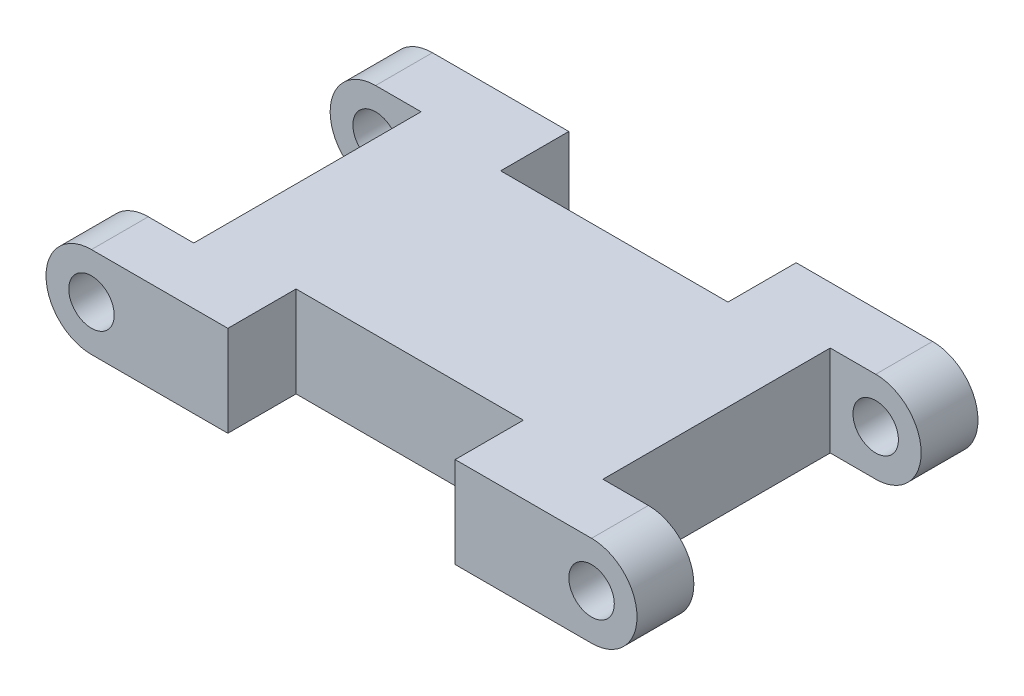
ISO-10303-21;
HEADER;
FILE_DESCRIPTION(('STEP AP214'),'2;1');
FILE_NAME('part.step','',(''),(''),'','','');
FILE_SCHEMA(('AUTOMOTIVE_DESIGN { 1 0 10303 214 1 1 1 1 }'));
ENDSEC;
DATA;
#1=APPLICATION_CONTEXT('core data for automotive mechanical design processes');
#2=APPLICATION_PROTOCOL_DEFINITION('international standard','automotive_design',2000,#1);
#3=PRODUCT_CONTEXT('',#1,'mechanical');
#4=PRODUCT('Part','Part','',(#3));
#5=PRODUCT_RELATED_PRODUCT_CATEGORY('part','',(#4));
#6=PRODUCT_DEFINITION_FORMATION('','',#4);
#7=PRODUCT_DEFINITION_CONTEXT('part definition',#1,'design');
#8=PRODUCT_DEFINITION('design','',#6,#7);
#9=PRODUCT_DEFINITION_SHAPE('','',#8);
#10=(LENGTH_UNIT() NAMED_UNIT(*) SI_UNIT(.MILLI.,.METRE.));
#11=(NAMED_UNIT(*) PLANE_ANGLE_UNIT() SI_UNIT($,.RADIAN.));
#12=(NAMED_UNIT(*) SI_UNIT($,.STERADIAN.) SOLID_ANGLE_UNIT());
#13=UNCERTAINTY_MEASURE_WITH_UNIT(LENGTH_MEASURE(1.E-05),#10,'distance_accuracy_value','');
#14=(GEOMETRIC_REPRESENTATION_CONTEXT(3) GLOBAL_UNCERTAINTY_ASSIGNED_CONTEXT((#13)) GLOBAL_UNIT_ASSIGNED_CONTEXT((#10,
#11,#12)) REPRESENTATION_CONTEXT('',''));
#15=CARTESIAN_POINT('',(0.,0.,0.));
#16=DIRECTION('',(0.,0.,1.));
#17=DIRECTION('',(1.,0.,0.));
#18=AXIS2_PLACEMENT_3D('',#15,#16,#17);
#19=CARTESIAN_POINT('',(-11.,2.,7.5));
#20=DIRECTION('',(0.,0.,1.));
#21=DIRECTION('',(1.,0.,0.));
#22=AXIS2_PLACEMENT_3D('',#19,#20,#21);
#23=PLANE('',#22);
#24=DIRECTION('',(0.,1.,0.));
#25=VECTOR('',#24,1.);
#26=CARTESIAN_POINT('',(5.,-0.00100000000000013,7.5));
#27=LINE('',#26,#25);
#28=CARTESIAN_POINT('',(5.,0.,7.5));
#29=VERTEX_POINT('',#28);
#30=CARTESIAN_POINT('',(5.,4.,7.5));
#31=VERTEX_POINT('',#30);
#32=EDGE_CURVE('E577',#29,#31,#27,.T.);
#33=ORIENTED_EDGE('',*,*,#32,.F.);
#34=DIRECTION('',(1.,0.,0.));
#35=VECTOR('',#34,1.);
#36=CARTESIAN_POINT('',(-11.,0.,7.5));
#37=LINE('',#36,#35);
#38=CARTESIAN_POINT('',(11.,0.,7.5));
#39=VERTEX_POINT('',#38);
#40=EDGE_CURVE('E206',#29,#39,#37,.T.);
#41=ORIENTED_EDGE('',*,*,#40,.T.);
#42=CARTESIAN_POINT('',(11.,2.,7.5));
#43=DIRECTION('',(0.,0.,1.));
#44=DIRECTION('',(1.,0.,0.));
#45=AXIS2_PLACEMENT_3D('',#42,#43,#44);
#46=CIRCLE('',#45,2.);
#47=CARTESIAN_POINT('',(11.,4.,7.5));
#48=VERTEX_POINT('',#47);
#49=EDGE_CURVE('E205',#39,#48,#46,.T.);
#50=ORIENTED_EDGE('',*,*,#49,.T.);
#51=DIRECTION('',(-1.,0.,0.));
#52=VECTOR('',#51,1.);
#53=CARTESIAN_POINT('',(-11.,4.,7.5));
#54=LINE('',#53,#52);
#55=EDGE_CURVE('E223',#48,#31,#54,.T.);
#56=ORIENTED_EDGE('',*,*,#55,.T.);
#57=EDGE_LOOP('',(#33,#41,#50,#56));
#58=FACE_BOUND('',#57,.T.);
#59=CARTESIAN_POINT('',(11.,2.,7.5));
#60=DIRECTION('',(0.,0.,1.));
#61=DIRECTION('',(1.,0.,0.));
#62=AXIS2_PLACEMENT_3D('',#59,#60,#61);
#63=CIRCLE('',#62,1.);
#64=CARTESIAN_POINT('',(12.,2.,7.5));
#65=VERTEX_POINT('',#64);
#66=EDGE_CURVE('E292',#65,#65,#63,.T.);
#67=ORIENTED_EDGE('',*,*,#66,.F.);
#68=EDGE_LOOP('',(#67));
#69=FACE_BOUND('',#68,.T.);
#70=ADVANCED_FACE('F37',(#58,#69),#23,.T.);
#71=CARTESIAN_POINT('',(-11.,2.,-7.5));
#72=DIRECTION('',(0.,0.,1.));
#73=DIRECTION('',(1.,0.,0.));
#74=AXIS2_PLACEMENT_3D('',#71,#72,#73);
#75=PLANE('',#74);
#76=CARTESIAN_POINT('',(11.,2.,-7.5));
#77=DIRECTION('',(0.,0.,1.));
#78=DIRECTION('',(1.,0.,0.));
#79=AXIS2_PLACEMENT_3D('',#76,#77,#78);
#80=CIRCLE('',#79,1.);
#81=CARTESIAN_POINT('',(12.,2.,-7.5));
#82=VERTEX_POINT('',#81);
#83=EDGE_CURVE('E183',#82,#82,#80,.T.);
#84=ORIENTED_EDGE('',*,*,#83,.T.);
#85=EDGE_LOOP('',(#84));
#86=FACE_BOUND('',#85,.T.);
#87=DIRECTION('',(1.,0.,0.));
#88=VECTOR('',#87,1.);
#89=CARTESIAN_POINT('',(-11.,0.,-7.5));
#90=LINE('',#89,#88);
#91=CARTESIAN_POINT('',(5.,0.,-7.5));
#92=VERTEX_POINT('',#91);
#93=CARTESIAN_POINT('',(11.,0.,-7.5));
#94=VERTEX_POINT('',#93);
#95=EDGE_CURVE('E230',#92,#94,#90,.T.);
#96=ORIENTED_EDGE('',*,*,#95,.F.);
#97=DIRECTION('',(0.,1.,0.));
#98=VECTOR('',#97,1.);
#99=CARTESIAN_POINT('',(5.,-0.00100000000000013,-7.5));
#100=LINE('',#99,#98);
#101=CARTESIAN_POINT('',(5.,4.,-7.5));
#102=VERTEX_POINT('',#101);
#103=EDGE_CURVE('E263',#92,#102,#100,.T.);
#104=ORIENTED_EDGE('',*,*,#103,.T.);
#105=DIRECTION('',(-1.,0.,0.));
#106=VECTOR('',#105,1.);
#107=CARTESIAN_POINT('',(-11.,4.,-7.5));
#108=LINE('',#107,#106);
#109=CARTESIAN_POINT('',(11.,4.,-7.5));
#110=VERTEX_POINT('',#109);
#111=EDGE_CURVE('E213',#110,#102,#108,.T.);
#112=ORIENTED_EDGE('',*,*,#111,.F.);
#113=CARTESIAN_POINT('',(11.,2.,-7.5));
#114=DIRECTION('',(0.,0.,1.));
#115=DIRECTION('',(1.,0.,0.));
#116=AXIS2_PLACEMENT_3D('',#113,#114,#115);
#117=CIRCLE('',#116,2.);
#118=EDGE_CURVE('E235',#94,#110,#117,.T.);
#119=ORIENTED_EDGE('',*,*,#118,.F.);
#120=EDGE_LOOP('',(#96,#104,#112,#119));
#121=FACE_BOUND('',#120,.T.);
#122=ADVANCED_FACE('F261',(#86,#121),#75,.F.);
#123=CARTESIAN_POINT('',(-11.,2.,7.5));
#124=DIRECTION('',(0.,0.,-1.));
#125=DIRECTION('',(-1.,0.,0.));
#126=AXIS2_PLACEMENT_3D('',#123,#124,#125);
#127=CYLINDRICAL_SURFACE('',#126,2.);
#128=DIRECTION('',(0.,0.,-1.));
#129=VECTOR('',#128,1.);
#130=CARTESIAN_POINT('',(-11.,0.,7.5));
#131=LINE('',#130,#129);
#132=CARTESIAN_POINT('',(-11.,0.,-5.));
#133=VERTEX_POINT('',#132);
#134=CARTESIAN_POINT('',(-11.,0.,-7.5));
#135=VERTEX_POINT('',#134);
#136=EDGE_CURVE('E45',#133,#135,#131,.T.);
#137=ORIENTED_EDGE('',*,*,#136,.F.);
#138=CARTESIAN_POINT('',(-11.,2.,-5.));
#139=DIRECTION('',(0.,0.,-1.));
#140=DIRECTION('',(-1.,0.,0.));
#141=AXIS2_PLACEMENT_3D('',#138,#139,#140);
#142=CIRCLE('',#141,2.);
#143=CARTESIAN_POINT('',(-11.,4.,-5.));
#144=VERTEX_POINT('',#143);
#145=EDGE_CURVE('E192',#144,#133,#142,.F.);
#146=ORIENTED_EDGE('',*,*,#145,.F.);
#147=DIRECTION('',(0.,0.,-1.));
#148=VECTOR('',#147,1.);
#149=CARTESIAN_POINT('',(-11.,4.,7.5));
#150=LINE('',#149,#148);
#151=CARTESIAN_POINT('',(-11.,4.,-7.5));
#152=VERTEX_POINT('',#151);
#153=EDGE_CURVE('E226',#144,#152,#150,.T.);
#154=ORIENTED_EDGE('',*,*,#153,.T.);
#155=CARTESIAN_POINT('',(-11.,2.,-7.5));
#156=DIRECTION('',(0.,0.,1.));
#157=DIRECTION('',(1.,0.,0.));
#158=AXIS2_PLACEMENT_3D('',#155,#156,#157);
#159=CIRCLE('',#158,2.);
#160=EDGE_CURVE('E227',#152,#135,#159,.T.);
#161=ORIENTED_EDGE('',*,*,#160,.T.);
#162=EDGE_LOOP('',(#137,#146,#154,#161));
#163=FACE_BOUND('',#162,.T.);
#164=ADVANCED_FACE('F317',(#163),#127,.T.);
#165=CARTESIAN_POINT('',(11.,2.,7.5));
#166=DIRECTION('',(0.,0.,-1.));
#167=DIRECTION('',(-1.,0.,0.));
#168=AXIS2_PLACEMENT_3D('',#165,#166,#167);
#169=CYLINDRICAL_SURFACE('',#168,2.);
#170=DIRECTION('',(0.,0.,-1.));
#171=VECTOR('',#170,1.);
#172=CARTESIAN_POINT('',(11.,4.,7.5));
#173=LINE('',#172,#171);
#174=CARTESIAN_POINT('',(11.,4.,-5.));
#175=VERTEX_POINT('',#174);
#176=EDGE_CURVE('E239',#175,#110,#173,.T.);
#177=ORIENTED_EDGE('',*,*,#176,.F.);
#178=CARTESIAN_POINT('',(11.,2.,-5.));
#179=DIRECTION('',(0.,0.,-1.));
#180=DIRECTION('',(-1.,0.,0.));
#181=AXIS2_PLACEMENT_3D('',#178,#179,#180);
#182=CIRCLE('',#181,2.);
#183=CARTESIAN_POINT('',(11.,0.,-5.));
#184=VERTEX_POINT('',#183);
#185=EDGE_CURVE('E257',#184,#175,#182,.F.);
#186=ORIENTED_EDGE('',*,*,#185,.F.);
#187=DIRECTION('',(0.,0.,-1.));
#188=VECTOR('',#187,1.);
#189=CARTESIAN_POINT('',(11.,0.,7.5));
#190=LINE('',#189,#188);
#191=EDGE_CURVE('E242',#184,#94,#190,.T.);
#192=ORIENTED_EDGE('',*,*,#191,.T.);
#193=ORIENTED_EDGE('',*,*,#118,.T.);
#194=EDGE_LOOP('',(#177,#186,#192,#193));
#195=FACE_BOUND('',#194,.T.);
#196=ADVANCED_FACE('F255',(#195),#169,.T.);
#197=CARTESIAN_POINT('',(-11.,2.,7.5));
#198=DIRECTION('',(0.,0.,-1.));
#199=DIRECTION('',(-1.,0.,0.));
#200=AXIS2_PLACEMENT_3D('',#197,#198,#199);
#201=CYLINDRICAL_SURFACE('',#200,1.);
#202=CARTESIAN_POINT('',(-11.,2.,-5.));
#203=DIRECTION('',(0.,0.,-1.));
#204=DIRECTION('',(-1.,0.,0.));
#205=AXIS2_PLACEMENT_3D('',#202,#203,#204);
#206=CIRCLE('',#205,1.);
#207=CARTESIAN_POINT('',(-12.,2.,-5.));
#208=VERTEX_POINT('',#207);
#209=EDGE_CURVE('E619',#208,#208,#206,.F.);
#210=ORIENTED_EDGE('',*,*,#209,.T.);
#211=EDGE_LOOP('',(#210));
#212=FACE_BOUND('',#211,.T.);
#213=CARTESIAN_POINT('',(-11.,2.,-7.5));
#214=DIRECTION('',(0.,0.,1.));
#215=DIRECTION('',(1.,0.,0.));
#216=AXIS2_PLACEMENT_3D('',#213,#214,#215);
#217=CIRCLE('',#216,1.);
#218=CARTESIAN_POINT('',(-10.,2.,-7.5));
#219=VERTEX_POINT('',#218);
#220=EDGE_CURVE('E219',#219,#219,#217,.T.);
#221=ORIENTED_EDGE('',*,*,#220,.F.);
#222=EDGE_LOOP('',(#221));
#223=FACE_BOUND('',#222,.T.);
#224=ADVANCED_FACE('F304',(#212,#223),#201,.F.);
#225=CARTESIAN_POINT('',(11.,2.,7.5));
#226=DIRECTION('',(0.,0.,-1.));
#227=DIRECTION('',(-1.,0.,0.));
#228=AXIS2_PLACEMENT_3D('',#225,#226,#227);
#229=CYLINDRICAL_SURFACE('',#228,1.);
#230=CARTESIAN_POINT('',(11.,2.,-5.));
#231=DIRECTION('',(0.,0.,-1.));
#232=DIRECTION('',(-1.,0.,0.));
#233=AXIS2_PLACEMENT_3D('',#230,#231,#232);
#234=CIRCLE('',#233,1.);
#235=CARTESIAN_POINT('',(10.,2.,-5.));
#236=VERTEX_POINT('',#235);
#237=EDGE_CURVE('E288',#236,#236,#234,.F.);
#238=ORIENTED_EDGE('',*,*,#237,.T.);
#239=EDGE_LOOP('',(#238));
#240=FACE_BOUND('',#239,.T.);
#241=ORIENTED_EDGE('',*,*,#83,.F.);
#242=EDGE_LOOP('',(#241));
#243=FACE_BOUND('',#242,.T.);
#244=ADVANCED_FACE('F306',(#240,#243),#229,.F.);
#245=DIRECTION('',(0.,1.,0.));
#246=VECTOR('',#245,1.);
#247=CARTESIAN_POINT('',(-5.,-0.00100000000000013,7.5));
#248=LINE('',#247,#246);
#249=CARTESIAN_POINT('',(-5.,0.,7.5));
#250=VERTEX_POINT('',#249);
#251=CARTESIAN_POINT('',(-5.,4.,7.5));
#252=VERTEX_POINT('',#251);
#253=EDGE_CURVE('E579',#250,#252,#248,.T.);
#254=ORIENTED_EDGE('',*,*,#253,.T.);
#255=CARTESIAN_POINT('',(-11.,4.,7.5));
#256=VERTEX_POINT('',#255);
#257=EDGE_CURVE('E212',#252,#256,#54,.T.);
#258=ORIENTED_EDGE('',*,*,#257,.T.);
#259=CARTESIAN_POINT('',(-11.,2.,7.5));
#260=DIRECTION('',(0.,0.,1.));
#261=DIRECTION('',(1.,0.,0.));
#262=AXIS2_PLACEMENT_3D('',#259,#260,#261);
#263=CIRCLE('',#262,2.);
#264=CARTESIAN_POINT('',(-11.,0.,7.5));
#265=VERTEX_POINT('',#264);
#266=EDGE_CURVE('E208',#256,#265,#263,.T.);
#267=ORIENTED_EDGE('',*,*,#266,.T.);
#268=EDGE_CURVE('E198',#265,#250,#37,.T.);
#269=ORIENTED_EDGE('',*,*,#268,.T.);
#270=EDGE_LOOP('',(#254,#258,#267,#269));
#271=FACE_BOUND('',#270,.T.);
#272=CARTESIAN_POINT('',(-11.,2.,7.5));
#273=DIRECTION('',(0.,0.,1.));
#274=DIRECTION('',(1.,0.,0.));
#275=AXIS2_PLACEMENT_3D('',#272,#273,#274);
#276=CIRCLE('',#275,1.);
#277=CARTESIAN_POINT('',(-10.,2.,7.5));
#278=VERTEX_POINT('',#277);
#279=EDGE_CURVE('E231',#278,#278,#276,.T.);
#280=ORIENTED_EDGE('',*,*,#279,.F.);
#281=EDGE_LOOP('',(#280));
#282=FACE_BOUND('',#281,.T.);
#283=ADVANCED_FACE('F209',(#271,#282),#23,.T.);
#284=CARTESIAN_POINT('',(-5.,4.,-7.5));
#285=VERTEX_POINT('',#284);
#286=EDGE_CURVE('E216',#285,#152,#108,.T.);
#287=ORIENTED_EDGE('',*,*,#286,.F.);
#288=DIRECTION('',(0.,1.,0.));
#289=VECTOR('',#288,1.);
#290=CARTESIAN_POINT('',(-5.,-0.00100000000000013,-7.5));
#291=LINE('',#290,#289);
#292=CARTESIAN_POINT('',(-5.,0.,-7.5));
#293=VERTEX_POINT('',#292);
#294=EDGE_CURVE('E551',#293,#285,#291,.T.);
#295=ORIENTED_EDGE('',*,*,#294,.F.);
#296=EDGE_CURVE('E232',#135,#293,#90,.T.);
#297=ORIENTED_EDGE('',*,*,#296,.F.);
#298=ORIENTED_EDGE('',*,*,#160,.F.);
#299=EDGE_LOOP('',(#287,#295,#297,#298));
#300=FACE_BOUND('',#299,.T.);
#301=ORIENTED_EDGE('',*,*,#220,.T.);
#302=EDGE_LOOP('',(#301));
#303=FACE_BOUND('',#302,.T.);
#304=ADVANCED_FACE('F302',(#300,#303),#75,.F.);
#305=CARTESIAN_POINT('',(-11.,4.,5.));
#306=VERTEX_POINT('',#305);
#307=EDGE_CURVE('E191',#256,#306,#150,.T.);
#308=ORIENTED_EDGE('',*,*,#307,.T.);
#309=CARTESIAN_POINT('',(-11.,2.,5.));
#310=DIRECTION('',(0.,0.,1.));
#311=DIRECTION('',(1.,0.,0.));
#312=AXIS2_PLACEMENT_3D('',#309,#310,#311);
#313=CIRCLE('',#312,2.);
#314=CARTESIAN_POINT('',(-11.,0.,5.));
#315=VERTEX_POINT('',#314);
#316=EDGE_CURVE('E178',#315,#306,#313,.F.);
#317=ORIENTED_EDGE('',*,*,#316,.F.);
#318=EDGE_CURVE('E11',#265,#315,#131,.T.);
#319=ORIENTED_EDGE('',*,*,#318,.F.);
#320=ORIENTED_EDGE('',*,*,#266,.F.);
#321=EDGE_LOOP('',(#308,#317,#319,#320));
#322=FACE_BOUND('',#321,.T.);
#323=ADVANCED_FACE('F39',(#322),#127,.T.);
#324=CARTESIAN_POINT('',(-11.,0.,7.5));
#325=DIRECTION('',(0.,1.,0.));
#326=DIRECTION('',(0.,0.,1.));
#327=AXIS2_PLACEMENT_3D('',#324,#325,#326);
#328=PLANE('',#327);
#329=DIRECTION('',(0.,0.,1.));
#330=VECTOR('',#329,1.);
#331=CARTESIAN_POINT('',(-9.,0.,-5.));
#332=LINE('',#331,#330);
#333=CARTESIAN_POINT('',(-9.,0.,-5.));
#334=VERTEX_POINT('',#333);
#335=CARTESIAN_POINT('',(-9.,0.,5.));
#336=VERTEX_POINT('',#335);
#337=EDGE_CURVE('E610',#334,#336,#332,.T.);
#338=ORIENTED_EDGE('',*,*,#337,.F.);
#339=DIRECTION('',(1.,0.,0.));
#340=VECTOR('',#339,1.);
#341=CARTESIAN_POINT('',(-13.,0.,-5.));
#342=LINE('',#341,#340);
#343=EDGE_CURVE('E549',#133,#334,#342,.T.);
#344=ORIENTED_EDGE('',*,*,#343,.F.);
#345=ORIENTED_EDGE('',*,*,#136,.T.);
#346=ORIENTED_EDGE('',*,*,#296,.T.);
#347=DIRECTION('',(0.,0.,-1.));
#348=VECTOR('',#347,1.);
#349=CARTESIAN_POINT('',(-5.,0.,-7.5));
#350=LINE('',#349,#348);
#351=CARTESIAN_POINT('',(-5.,0.,-4.5));
#352=VERTEX_POINT('',#351);
#353=EDGE_CURVE('E193',#352,#293,#350,.T.);
#354=ORIENTED_EDGE('',*,*,#353,.F.);
#355=DIRECTION('',(-1.,0.,0.));
#356=VECTOR('',#355,1.);
#357=CARTESIAN_POINT('',(-5.,0.,-4.5));
#358=LINE('',#357,#356);
#359=CARTESIAN_POINT('',(5.,0.,-4.5));
#360=VERTEX_POINT('',#359);
#361=EDGE_CURVE('E583',#360,#352,#358,.T.);
#362=ORIENTED_EDGE('',*,*,#361,.F.);
#363=DIRECTION('',(0.,0.,1.));
#364=VECTOR('',#363,1.);
#365=CARTESIAN_POINT('',(5.,0.,-4.5));
#366=LINE('',#365,#364);
#367=EDGE_CURVE('E623',#92,#360,#366,.T.);
#368=ORIENTED_EDGE('',*,*,#367,.F.);
#369=ORIENTED_EDGE('',*,*,#95,.T.);
#370=ORIENTED_EDGE('',*,*,#191,.F.);
#371=DIRECTION('',(1.,0.,0.));
#372=VECTOR('',#371,1.);
#373=CARTESIAN_POINT('',(13.,0.,-5.));
#374=LINE('',#373,#372);
#375=CARTESIAN_POINT('',(9.,0.,-5.));
#376=VERTEX_POINT('',#375);
#377=EDGE_CURVE('E592',#376,#184,#374,.T.);
#378=ORIENTED_EDGE('',*,*,#377,.F.);
#379=DIRECTION('',(0.,0.,-1.));
#380=VECTOR('',#379,1.);
#381=CARTESIAN_POINT('',(9.,0.,-5.));
#382=LINE('',#381,#380);
#383=CARTESIAN_POINT('',(9.,0.,5.));
#384=VERTEX_POINT('',#383);
#385=EDGE_CURVE('E589',#384,#376,#382,.T.);
#386=ORIENTED_EDGE('',*,*,#385,.F.);
#387=DIRECTION('',(-1.,0.,0.));
#388=VECTOR('',#387,1.);
#389=CARTESIAN_POINT('',(9.,0.,5.));
#390=LINE('',#389,#388);
#391=CARTESIAN_POINT('',(11.,0.,5.));
#392=VERTEX_POINT('',#391);
#393=EDGE_CURVE('E283',#392,#384,#390,.T.);
#394=ORIENTED_EDGE('',*,*,#393,.F.);
#395=EDGE_CURVE('E243',#39,#392,#190,.T.);
#396=ORIENTED_EDGE('',*,*,#395,.F.);
#397=ORIENTED_EDGE('',*,*,#40,.F.);
#398=DIRECTION('',(0.,0.,1.));
#399=VECTOR('',#398,1.);
#400=CARTESIAN_POINT('',(5.,0.,4.5));
#401=LINE('',#400,#399);
#402=CARTESIAN_POINT('',(5.,0.,4.5));
#403=VERTEX_POINT('',#402);
#404=EDGE_CURVE('E566',#403,#29,#401,.T.);
#405=ORIENTED_EDGE('',*,*,#404,.F.);
#406=DIRECTION('',(1.,0.,0.));
#407=VECTOR('',#406,1.);
#408=CARTESIAN_POINT('',(-5.,0.,4.5));
#409=LINE('',#408,#407);
#410=CARTESIAN_POINT('',(-5.,0.,4.5));
#411=VERTEX_POINT('',#410);
#412=EDGE_CURVE('E291',#411,#403,#409,.T.);
#413=ORIENTED_EDGE('',*,*,#412,.F.);
#414=DIRECTION('',(0.,0.,-1.));
#415=VECTOR('',#414,1.);
#416=CARTESIAN_POINT('',(-5.,0.,7.5));
#417=LINE('',#416,#415);
#418=EDGE_CURVE('E202',#250,#411,#417,.T.);
#419=ORIENTED_EDGE('',*,*,#418,.F.);
#420=ORIENTED_EDGE('',*,*,#268,.F.);
#421=ORIENTED_EDGE('',*,*,#318,.T.);
#422=DIRECTION('',(-1.,0.,0.));
#423=VECTOR('',#422,1.);
#424=CARTESIAN_POINT('',(-9.,0.,5.));
#425=LINE('',#424,#423);
#426=EDGE_CURVE('E174',#336,#315,#425,.T.);
#427=ORIENTED_EDGE('',*,*,#426,.F.);
#428=EDGE_LOOP('',(#338,#344,#345,#346,#354,#362,#368,#369,#370,#378,#386,#394,#396,#397,#405,
#413,#419,#420,#421,#427));
#429=FACE_BOUND('',#428,.T.);
#430=ADVANCED_FACE('F195',(#429),#328,.F.);
#431=ORIENTED_EDGE('',*,*,#395,.T.);
#432=CARTESIAN_POINT('',(11.,2.,5.));
#433=DIRECTION('',(0.,0.,1.));
#434=DIRECTION('',(1.,0.,0.));
#435=AXIS2_PLACEMENT_3D('',#432,#433,#434);
#436=CIRCLE('',#435,2.);
#437=CARTESIAN_POINT('',(11.,4.,5.));
#438=VERTEX_POINT('',#437);
#439=EDGE_CURVE('E584',#438,#392,#436,.F.);
#440=ORIENTED_EDGE('',*,*,#439,.F.);
#441=EDGE_CURVE('E240',#48,#438,#173,.T.);
#442=ORIENTED_EDGE('',*,*,#441,.F.);
#443=ORIENTED_EDGE('',*,*,#49,.F.);
#444=EDGE_LOOP('',(#431,#440,#442,#443));
#445=FACE_BOUND('',#444,.T.);
#446=ADVANCED_FACE('F319',(#445),#169,.T.);
#447=CARTESIAN_POINT('',(-11.,4.,7.5));
#448=DIRECTION('',(0.,-1.,0.));
#449=DIRECTION('',(0.,0.,-1.));
#450=AXIS2_PLACEMENT_3D('',#447,#448,#449);
#451=PLANE('',#450);
#452=ORIENTED_EDGE('',*,*,#153,.F.);
#453=DIRECTION('',(-1.,0.,0.));
#454=VECTOR('',#453,1.);
#455=CARTESIAN_POINT('',(-13.,4.,-5.));
#456=LINE('',#455,#454);
#457=CARTESIAN_POINT('',(-9.,4.,-5.));
#458=VERTEX_POINT('',#457);
#459=EDGE_CURVE('E608',#458,#144,#456,.T.);
#460=ORIENTED_EDGE('',*,*,#459,.F.);
#461=DIRECTION('',(0.,0.,-1.));
#462=VECTOR('',#461,1.);
#463=CARTESIAN_POINT('',(-9.,4.,-5.));
#464=LINE('',#463,#462);
#465=CARTESIAN_POINT('',(-9.,4.,5.));
#466=VERTEX_POINT('',#465);
#467=EDGE_CURVE('E606',#466,#458,#464,.T.);
#468=ORIENTED_EDGE('',*,*,#467,.F.);
#469=DIRECTION('',(1.,0.,0.));
#470=VECTOR('',#469,1.);
#471=CARTESIAN_POINT('',(-9.,4.,5.));
#472=LINE('',#471,#470);
#473=EDGE_CURVE('E603',#306,#466,#472,.T.);
#474=ORIENTED_EDGE('',*,*,#473,.F.);
#475=ORIENTED_EDGE('',*,*,#307,.F.);
#476=ORIENTED_EDGE('',*,*,#257,.F.);
#477=DIRECTION('',(0.,0.,1.));
#478=VECTOR('',#477,1.);
#479=CARTESIAN_POINT('',(-5.,4.,7.5));
#480=LINE('',#479,#478);
#481=CARTESIAN_POINT('',(-5.,4.,4.5));
#482=VERTEX_POINT('',#481);
#483=EDGE_CURVE('E569',#482,#252,#480,.T.);
#484=ORIENTED_EDGE('',*,*,#483,.F.);
#485=DIRECTION('',(-1.,0.,0.));
#486=VECTOR('',#485,1.);
#487=CARTESIAN_POINT('',(-5.,4.,4.5));
#488=LINE('',#487,#486);
#489=CARTESIAN_POINT('',(5.,4.,4.5));
#490=VERTEX_POINT('',#489);
#491=EDGE_CURVE('E52',#490,#482,#488,.T.);
#492=ORIENTED_EDGE('',*,*,#491,.F.);
#493=DIRECTION('',(0.,0.,-1.));
#494=VECTOR('',#493,1.);
#495=CARTESIAN_POINT('',(5.,4.,4.5));
#496=LINE('',#495,#494);
#497=EDGE_CURVE('E571',#31,#490,#496,.T.);
#498=ORIENTED_EDGE('',*,*,#497,.F.);
#499=ORIENTED_EDGE('',*,*,#55,.F.);
#500=ORIENTED_EDGE('',*,*,#441,.T.);
#501=DIRECTION('',(1.,0.,0.));
#502=VECTOR('',#501,1.);
#503=CARTESIAN_POINT('',(9.,4.,5.));
#504=LINE('',#503,#502);
#505=CARTESIAN_POINT('',(9.,4.,5.));
#506=VERTEX_POINT('',#505);
#507=EDGE_CURVE('E276',#506,#438,#504,.T.);
#508=ORIENTED_EDGE('',*,*,#507,.F.);
#509=DIRECTION('',(0.,0.,1.));
#510=VECTOR('',#509,1.);
#511=CARTESIAN_POINT('',(9.,4.,-5.));
#512=LINE('',#511,#510);
#513=CARTESIAN_POINT('',(9.,4.,-5.));
#514=VERTEX_POINT('',#513);
#515=EDGE_CURVE('E60',#514,#506,#512,.T.);
#516=ORIENTED_EDGE('',*,*,#515,.F.);
#517=DIRECTION('',(-1.,0.,0.));
#518=VECTOR('',#517,1.);
#519=CARTESIAN_POINT('',(13.,4.,-5.));
#520=LINE('',#519,#518);
#521=EDGE_CURVE('E272',#175,#514,#520,.T.);
#522=ORIENTED_EDGE('',*,*,#521,.F.);
#523=ORIENTED_EDGE('',*,*,#176,.T.);
#524=ORIENTED_EDGE('',*,*,#111,.T.);
#525=DIRECTION('',(0.,0.,-1.));
#526=VECTOR('',#525,1.);
#527=CARTESIAN_POINT('',(5.,4.,-4.5));
#528=LINE('',#527,#526);
#529=CARTESIAN_POINT('',(5.,4.,-4.5));
#530=VERTEX_POINT('',#529);
#531=EDGE_CURVE('E269',#530,#102,#528,.T.);
#532=ORIENTED_EDGE('',*,*,#531,.F.);
#533=DIRECTION('',(1.,0.,0.));
#534=VECTOR('',#533,1.);
#535=CARTESIAN_POINT('',(-5.,4.,-4.5));
#536=LINE('',#535,#534);
#537=CARTESIAN_POINT('',(-5.,4.,-4.5));
#538=VERTEX_POINT('',#537);
#539=EDGE_CURVE('E559',#538,#530,#536,.T.);
#540=ORIENTED_EDGE('',*,*,#539,.F.);
#541=DIRECTION('',(0.,0.,1.));
#542=VECTOR('',#541,1.);
#543=CARTESIAN_POINT('',(-5.,4.,-7.5));
#544=LINE('',#543,#542);
#545=EDGE_CURVE('E626',#285,#538,#544,.T.);
#546=ORIENTED_EDGE('',*,*,#545,.F.);
#547=ORIENTED_EDGE('',*,*,#286,.T.);
#548=EDGE_LOOP('',(#452,#460,#468,#474,#475,#476,#484,#492,#498,#499,#500,#508,#516,#522,#523,
#524,#532,#540,#546,#547));
#549=FACE_BOUND('',#548,.T.);
#550=ADVANCED_FACE('F267',(#549),#451,.F.);
#551=CARTESIAN_POINT('',(-11.,2.,5.));
#552=DIRECTION('',(0.,0.,1.));
#553=DIRECTION('',(1.,0.,0.));
#554=AXIS2_PLACEMENT_3D('',#551,#552,#553);
#555=CIRCLE('',#554,1.);
#556=CARTESIAN_POINT('',(-10.,2.,5.));
#557=VERTEX_POINT('',#556);
#558=EDGE_CURVE('E617',#557,#557,#555,.F.);
#559=ORIENTED_EDGE('',*,*,#558,.T.);
#560=EDGE_LOOP('',(#559));
#561=FACE_BOUND('',#560,.T.);
#562=ORIENTED_EDGE('',*,*,#279,.T.);
#563=EDGE_LOOP('',(#562));
#564=FACE_BOUND('',#563,.T.);
#565=ADVANCED_FACE('F309',(#561,#564),#201,.F.);
#566=CARTESIAN_POINT('',(11.,2.,5.));
#567=DIRECTION('',(0.,0.,1.));
#568=DIRECTION('',(1.,0.,0.));
#569=AXIS2_PLACEMENT_3D('',#566,#567,#568);
#570=CIRCLE('',#569,1.);
#571=CARTESIAN_POINT('',(12.,2.,4.99999999999999));
#572=VERTEX_POINT('',#571);
#573=EDGE_CURVE('E285',#572,#572,#570,.F.);
#574=ORIENTED_EDGE('',*,*,#573,.T.);
#575=EDGE_LOOP('',(#574));
#576=FACE_BOUND('',#575,.T.);
#577=ORIENTED_EDGE('',*,*,#66,.T.);
#578=EDGE_LOOP('',(#577));
#579=FACE_BOUND('',#578,.T.);
#580=ADVANCED_FACE('F316',(#576,#579),#229,.F.);
#581=CARTESIAN_POINT('',(9.,-0.00100000000000013,-5.));
#582=DIRECTION('',(-1.,0.,0.));
#583=DIRECTION('',(0.,0.,1.));
#584=AXIS2_PLACEMENT_3D('',#581,#582,#583);
#585=PLANE('',#584);
#586=ORIENTED_EDGE('',*,*,#385,.T.);
#587=DIRECTION('',(0.,1.,0.));
#588=VECTOR('',#587,1.);
#589=CARTESIAN_POINT('',(9.,-0.00100000000000013,-5.));
#590=LINE('',#589,#588);
#591=EDGE_CURVE('E278',#376,#514,#590,.T.);
#592=ORIENTED_EDGE('',*,*,#591,.T.);
#593=ORIENTED_EDGE('',*,*,#515,.T.);
#594=DIRECTION('',(0.,1.,0.));
#595=VECTOR('',#594,1.);
#596=CARTESIAN_POINT('',(9.,-0.00100000000000013,5.));
#597=LINE('',#596,#595);
#598=EDGE_CURVE('E275',#384,#506,#597,.T.);
#599=ORIENTED_EDGE('',*,*,#598,.F.);
#600=EDGE_LOOP('',(#586,#592,#593,#599));
#601=FACE_BOUND('',#600,.T.);
#602=ADVANCED_FACE('F368',(#601),#585,.F.);
#603=CARTESIAN_POINT('',(13.,-0.00100000000000013,-5.));
#604=DIRECTION('',(0.,0.,-1.));
#605=DIRECTION('',(-1.,0.,0.));
#606=AXIS2_PLACEMENT_3D('',#603,#604,#605);
#607=PLANE('',#606);
#608=ORIENTED_EDGE('',*,*,#237,.F.);
#609=EDGE_LOOP('',(#608));
#610=FACE_BOUND('',#609,.T.);
#611=ORIENTED_EDGE('',*,*,#377,.T.);
#612=ORIENTED_EDGE('',*,*,#185,.T.);
#613=ORIENTED_EDGE('',*,*,#521,.T.);
#614=ORIENTED_EDGE('',*,*,#591,.F.);
#615=EDGE_LOOP('',(#611,#612,#613,#614));
#616=FACE_BOUND('',#615,.T.);
#617=ADVANCED_FACE('F375',(#610,#616),#607,.F.);
#618=CARTESIAN_POINT('',(9.,-0.00100000000000013,5.));
#619=DIRECTION('',(0.,0.,1.));
#620=DIRECTION('',(1.,0.,0.));
#621=AXIS2_PLACEMENT_3D('',#618,#619,#620);
#622=PLANE('',#621);
#623=ORIENTED_EDGE('',*,*,#573,.F.);
#624=EDGE_LOOP('',(#623));
#625=FACE_BOUND('',#624,.T.);
#626=ORIENTED_EDGE('',*,*,#393,.T.);
#627=ORIENTED_EDGE('',*,*,#598,.T.);
#628=ORIENTED_EDGE('',*,*,#507,.T.);
#629=ORIENTED_EDGE('',*,*,#439,.T.);
#630=EDGE_LOOP('',(#626,#627,#628,#629));
#631=FACE_BOUND('',#630,.T.);
#632=ADVANCED_FACE('F382',(#625,#631),#622,.F.);
#633=CARTESIAN_POINT('',(-13.,-0.00100000000000013,-5.));
#634=DIRECTION('',(0.,0.,-1.));
#635=DIRECTION('',(-1.,0.,0.));
#636=AXIS2_PLACEMENT_3D('',#633,#634,#635);
#637=PLANE('',#636);
#638=ORIENTED_EDGE('',*,*,#209,.F.);
#639=EDGE_LOOP('',(#638));
#640=FACE_BOUND('',#639,.T.);
#641=ORIENTED_EDGE('',*,*,#145,.T.);
#642=ORIENTED_EDGE('',*,*,#343,.T.);
#643=DIRECTION('',(0.,1.,0.));
#644=VECTOR('',#643,1.);
#645=CARTESIAN_POINT('',(-9.,-0.00100000000000013,-5.));
#646=LINE('',#645,#644);
#647=EDGE_CURVE('E184',#334,#458,#646,.T.);
#648=ORIENTED_EDGE('',*,*,#647,.T.);
#649=ORIENTED_EDGE('',*,*,#459,.T.);
#650=EDGE_LOOP('',(#641,#642,#648,#649));
#651=FACE_BOUND('',#650,.T.);
#652=ADVANCED_FACE('F390',(#640,#651),#637,.F.);
#653=CARTESIAN_POINT('',(-9.,-0.00100000000000013,-5.));
#654=DIRECTION('',(1.,0.,0.));
#655=DIRECTION('',(0.,0.,-1.));
#656=AXIS2_PLACEMENT_3D('',#653,#654,#655);
#657=PLANE('',#656);
#658=ORIENTED_EDGE('',*,*,#337,.T.);
#659=DIRECTION('',(0.,1.,0.));
#660=VECTOR('',#659,1.);
#661=CARTESIAN_POINT('',(-9.,-0.00100000000000013,5.));
#662=LINE('',#661,#660);
#663=EDGE_CURVE('E180',#336,#466,#662,.T.);
#664=ORIENTED_EDGE('',*,*,#663,.T.);
#665=ORIENTED_EDGE('',*,*,#467,.T.);
#666=ORIENTED_EDGE('',*,*,#647,.F.);
#667=EDGE_LOOP('',(#658,#664,#665,#666));
#668=FACE_BOUND('',#667,.T.);
#669=ADVANCED_FACE('F398',(#668),#657,.F.);
#670=CARTESIAN_POINT('',(-9.,-0.00100000000000013,5.));
#671=DIRECTION('',(0.,0.,1.));
#672=DIRECTION('',(1.,0.,0.));
#673=AXIS2_PLACEMENT_3D('',#670,#671,#672);
#674=PLANE('',#673);
#675=ORIENTED_EDGE('',*,*,#558,.F.);
#676=EDGE_LOOP('',(#675));
#677=FACE_BOUND('',#676,.T.);
#678=ORIENTED_EDGE('',*,*,#473,.T.);
#679=ORIENTED_EDGE('',*,*,#663,.F.);
#680=ORIENTED_EDGE('',*,*,#426,.T.);
#681=ORIENTED_EDGE('',*,*,#316,.T.);
#682=EDGE_LOOP('',(#678,#679,#680,#681));
#683=FACE_BOUND('',#682,.T.);
#684=ADVANCED_FACE('F177',(#677,#683),#674,.F.);
#685=CARTESIAN_POINT('',(-5.,-0.00100000000000013,4.5));
#686=DIRECTION('',(0.,0.,-1.));
#687=DIRECTION('',(-1.,0.,0.));
#688=AXIS2_PLACEMENT_3D('',#685,#686,#687);
#689=PLANE('',#688);
#690=ORIENTED_EDGE('',*,*,#412,.T.);
#691=DIRECTION('',(0.,1.,0.));
#692=VECTOR('',#691,1.);
#693=CARTESIAN_POINT('',(5.,-0.00100000000000013,4.5));
#694=LINE('',#693,#692);
#695=EDGE_CURVE('E575',#403,#490,#694,.T.);
#696=ORIENTED_EDGE('',*,*,#695,.T.);
#697=ORIENTED_EDGE('',*,*,#491,.T.);
#698=DIRECTION('',(0.,1.,0.));
#699=VECTOR('',#698,1.);
#700=CARTESIAN_POINT('',(-5.,-0.00100000000000013,4.5));
#701=LINE('',#700,#699);
#702=EDGE_CURVE('E574',#411,#482,#701,.T.);
#703=ORIENTED_EDGE('',*,*,#702,.F.);
#704=EDGE_LOOP('',(#690,#696,#697,#703));
#705=FACE_BOUND('',#704,.T.);
#706=ADVANCED_FACE('F413',(#705),#689,.F.);
#707=CARTESIAN_POINT('',(5.,-0.00100000000000013,4.5));
#708=DIRECTION('',(1.,0.,0.));
#709=DIRECTION('',(0.,0.,-1.));
#710=AXIS2_PLACEMENT_3D('',#707,#708,#709);
#711=PLANE('',#710);
#712=ORIENTED_EDGE('',*,*,#404,.T.);
#713=ORIENTED_EDGE('',*,*,#32,.T.);
#714=ORIENTED_EDGE('',*,*,#497,.T.);
#715=ORIENTED_EDGE('',*,*,#695,.F.);
#716=EDGE_LOOP('',(#712,#713,#714,#715));
#717=FACE_BOUND('',#716,.T.);
#718=ADVANCED_FACE('F421',(#717),#711,.F.);
#719=CARTESIAN_POINT('',(-5.,-0.00100000000000013,7.5));
#720=DIRECTION('',(-1.,0.,0.));
#721=DIRECTION('',(0.,0.,1.));
#722=AXIS2_PLACEMENT_3D('',#719,#720,#721);
#723=PLANE('',#722);
#724=ORIENTED_EDGE('',*,*,#418,.T.);
#725=ORIENTED_EDGE('',*,*,#702,.T.);
#726=ORIENTED_EDGE('',*,*,#483,.T.);
#727=ORIENTED_EDGE('',*,*,#253,.F.);
#728=EDGE_LOOP('',(#724,#725,#726,#727));
#729=FACE_BOUND('',#728,.T.);
#730=ADVANCED_FACE('F428',(#729),#723,.F.);
#731=CARTESIAN_POINT('',(5.,-0.00100000000000013,-4.5));
#732=DIRECTION('',(1.,0.,0.));
#733=DIRECTION('',(0.,0.,-1.));
#734=AXIS2_PLACEMENT_3D('',#731,#732,#733);
#735=PLANE('',#734);
#736=ORIENTED_EDGE('',*,*,#367,.T.);
#737=DIRECTION('',(0.,1.,0.));
#738=VECTOR('',#737,1.);
#739=CARTESIAN_POINT('',(5.,-0.00100000000000013,-4.5));
#740=LINE('',#739,#738);
#741=EDGE_CURVE('E557',#360,#530,#740,.T.);
#742=ORIENTED_EDGE('',*,*,#741,.T.);
#743=ORIENTED_EDGE('',*,*,#531,.T.);
#744=ORIENTED_EDGE('',*,*,#103,.F.);
#745=EDGE_LOOP('',(#736,#742,#743,#744));
#746=FACE_BOUND('',#745,.T.);
#747=ADVANCED_FACE('F436',(#746),#735,.F.);
#748=CARTESIAN_POINT('',(-5.,-0.00100000000000013,-4.5));
#749=DIRECTION('',(0.,0.,1.));
#750=DIRECTION('',(1.,0.,0.));
#751=AXIS2_PLACEMENT_3D('',#748,#749,#750);
#752=PLANE('',#751);
#753=ORIENTED_EDGE('',*,*,#361,.T.);
#754=DIRECTION('',(0.,1.,0.));
#755=VECTOR('',#754,1.);
#756=CARTESIAN_POINT('',(-5.,-0.00100000000000013,-4.5));
#757=LINE('',#756,#755);
#758=EDGE_CURVE('E555',#352,#538,#757,.T.);
#759=ORIENTED_EDGE('',*,*,#758,.T.);
#760=ORIENTED_EDGE('',*,*,#539,.T.);
#761=ORIENTED_EDGE('',*,*,#741,.F.);
#762=EDGE_LOOP('',(#753,#759,#760,#761));
#763=FACE_BOUND('',#762,.T.);
#764=ADVANCED_FACE('F444',(#763),#752,.F.);
#765=CARTESIAN_POINT('',(-5.,-0.00100000000000013,-7.5));
#766=DIRECTION('',(-1.,0.,0.));
#767=DIRECTION('',(0.,0.,1.));
#768=AXIS2_PLACEMENT_3D('',#765,#766,#767);
#769=PLANE('',#768);
#770=ORIENTED_EDGE('',*,*,#353,.T.);
#771=ORIENTED_EDGE('',*,*,#294,.T.);
#772=ORIENTED_EDGE('',*,*,#545,.T.);
#773=ORIENTED_EDGE('',*,*,#758,.F.);
#774=EDGE_LOOP('',(#770,#771,#772,#773));
#775=FACE_BOUND('',#774,.T.);
#776=ADVANCED_FACE('F452',(#775),#769,.F.);
#777=CLOSED_SHELL('',(#70,#122,#164,#196,#224,#244,#283,#304,#323,#430,#446,#550,#565,#580,#602,
#617,#632,#652,#669,#684,#706,#718,#730,#747,#764,#776));
#778=MANIFOLD_SOLID_BREP('B2',#777);
#779=ADVANCED_BREP_SHAPE_REPRESENTATION('',(#18,#778),#14);
#780=SHAPE_DEFINITION_REPRESENTATION(#9,#779);
ENDSEC;
END-ISO-10303-21;
